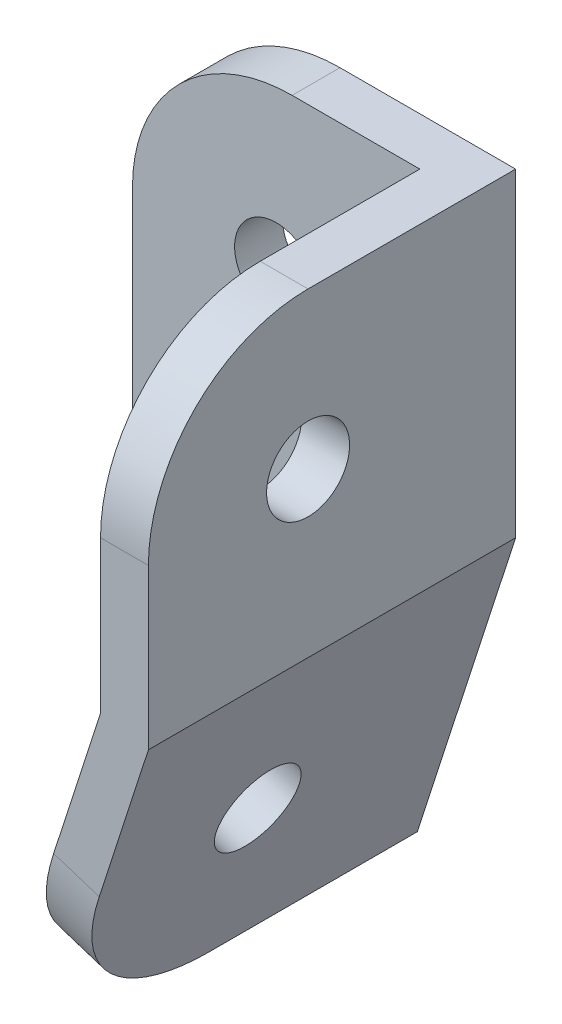
ISO-10303-21;
HEADER;
FILE_DESCRIPTION(('STEP AP214'),'2;1');
FILE_NAME('part.step','',(''),(''),'','','');
FILE_SCHEMA(('AUTOMOTIVE_DESIGN { 1 0 10303 214 1 1 1 1 }'));
ENDSEC;
DATA;
#1=APPLICATION_CONTEXT('core data for automotive mechanical design processes');
#2=APPLICATION_PROTOCOL_DEFINITION('international standard','automotive_design',2000,#1);
#3=PRODUCT_CONTEXT('',#1,'mechanical');
#4=PRODUCT('Part','Part','',(#3));
#5=PRODUCT_RELATED_PRODUCT_CATEGORY('part','',(#4));
#6=PRODUCT_DEFINITION_FORMATION('','',#4);
#7=PRODUCT_DEFINITION_CONTEXT('part definition',#1,'design');
#8=PRODUCT_DEFINITION('design','',#6,#7);
#9=PRODUCT_DEFINITION_SHAPE('','',#8);
#10=(LENGTH_UNIT() NAMED_UNIT(*) SI_UNIT(.MILLI.,.METRE.));
#11=(NAMED_UNIT(*) PLANE_ANGLE_UNIT() SI_UNIT($,.RADIAN.));
#12=(NAMED_UNIT(*) SI_UNIT($,.STERADIAN.) SOLID_ANGLE_UNIT());
#13=UNCERTAINTY_MEASURE_WITH_UNIT(LENGTH_MEASURE(1.E-05),#10,'distance_accuracy_value','');
#14=(GEOMETRIC_REPRESENTATION_CONTEXT(3) GLOBAL_UNCERTAINTY_ASSIGNED_CONTEXT((#13)) GLOBAL_UNIT_ASSIGNED_CONTEXT((#10,
#11,#12)) REPRESENTATION_CONTEXT('',''));
#15=CARTESIAN_POINT('',(0.,0.,0.));
#16=DIRECTION('',(0.,0.,1.));
#17=DIRECTION('',(1.,0.,0.));
#18=AXIS2_PLACEMENT_3D('',#15,#16,#17);
#19=CARTESIAN_POINT('',(97.,112.65,23.));
#20=DIRECTION('',(1.,0.,0.));
#21=DIRECTION('',(0.,0.,-1.));
#22=AXIS2_PLACEMENT_3D('',#19,#20,#21);
#23=PLANE('',#22);
#24=CARTESIAN_POINT('',(97.,102.886797305567,13.));
#25=DIRECTION('',(-1.,0.,0.));
#26=DIRECTION('',(0.,0.,1.));
#27=AXIS2_PLACEMENT_3D('',#24,#25,#26);
#28=CIRCLE('',#27,2.6);
#29=CARTESIAN_POINT('',(97.,102.886797305567,15.6));
#30=VERTEX_POINT('',#29);
#31=EDGE_CURVE('E305',#30,#30,#28,.T.);
#32=ORIENTED_EDGE('',*,*,#31,.F.);
#33=EDGE_LOOP('',(#32));
#34=FACE_BOUND('',#33,.T.);
#35=DIRECTION('',(0.,-1.,0.));
#36=VECTOR('',#35,1.);
#37=CARTESIAN_POINT('',(97.,112.65,23.));
#38=LINE('',#37,#36);
#39=CARTESIAN_POINT('',(97.,102.65,23.));
#40=VERTEX_POINT('',#39);
#41=CARTESIAN_POINT('',(97.,93.1235946111336,23.));
#42=VERTEX_POINT('',#41);
#43=EDGE_CURVE('E154',#40,#42,#38,.T.);
#44=ORIENTED_EDGE('',*,*,#43,.F.);
#45=CARTESIAN_POINT('',(97.,102.65,13.));
#46=DIRECTION('',(1.,0.,0.));
#47=DIRECTION('',(0.,0.,-1.));
#48=AXIS2_PLACEMENT_3D('',#45,#46,#47);
#49=CIRCLE('',#48,10.);
#50=CARTESIAN_POINT('',(97.,112.65,13.));
#51=VERTEX_POINT('',#50);
#52=EDGE_CURVE('E65',#40,#51,#49,.F.);
#53=ORIENTED_EDGE('',*,*,#52,.T.);
#54=DIRECTION('',(0.,0.,-1.));
#55=VECTOR('',#54,1.);
#56=CARTESIAN_POINT('',(97.,112.65,23.));
#57=LINE('',#56,#55);
#58=CARTESIAN_POINT('',(97.,112.65,3.));
#59=VERTEX_POINT('',#58);
#60=EDGE_CURVE('E165',#51,#59,#57,.T.);
#61=ORIENTED_EDGE('',*,*,#60,.T.);
#62=DIRECTION('',(0.,1.,0.));
#63=VECTOR('',#62,1.);
#64=CARTESIAN_POINT('',(97.,93.1235946111336,3.));
#65=LINE('',#64,#63);
#66=CARTESIAN_POINT('',(97.,93.1235946111336,3.));
#67=VERTEX_POINT('',#66);
#68=EDGE_CURVE('E258',#67,#59,#65,.T.);
#69=ORIENTED_EDGE('',*,*,#68,.F.);
#70=DIRECTION('',(0.,0.,-1.));
#71=VECTOR('',#70,1.);
#72=CARTESIAN_POINT('',(97.,93.1235946111336,23.));
#73=LINE('',#72,#71);
#74=EDGE_CURVE('E276',#42,#67,#73,.T.);
#75=ORIENTED_EDGE('',*,*,#74,.F.);
#76=EDGE_LOOP('',(#44,#53,#61,#69,#75));
#77=FACE_BOUND('',#76,.T.);
#78=ADVANCED_FACE('F44',(#34,#77),#23,.F.);
#79=CARTESIAN_POINT('',(97.,93.1235946111336,23.));
#80=DIRECTION('',(0.951369306348152,-0.308052662605985,0.));
#81=DIRECTION('',(0.308052662605985,0.951369306348152,0.));
#82=AXIS2_PLACEMENT_3D('',#79,#80,#81);
#83=PLANE('',#82);
#84=CARTESIAN_POINT('',(93.992419414418,83.8351832359943,13.));
#85=DIRECTION('',(-0.951369306348152,0.308052662605985,0.));
#86=DIRECTION('',(-0.308052662605985,-0.951369306348152,0.));
#87=AXIS2_PLACEMENT_3D('',#84,#85,#86);
#88=CIRCLE('',#87,2.6);
#89=CARTESIAN_POINT('',(93.1914824916424,81.3616230394891,13.));
#90=VERTEX_POINT('',#89);
#91=EDGE_CURVE('E311',#90,#90,#88,.T.);
#92=ORIENTED_EDGE('',*,*,#91,.F.);
#93=EDGE_LOOP('',(#92));
#94=FACE_BOUND('',#93,.T.);
#95=DIRECTION('',(0.,0.,-1.));
#96=VECTOR('',#95,1.);
#97=CARTESIAN_POINT('',(90.9848388288358,74.5467718608549,23.));
#98=LINE('',#97,#96);
#99=CARTESIAN_POINT('',(90.9848388288358,74.5467718608549,13.));
#100=VERTEX_POINT('',#99);
#101=CARTESIAN_POINT('',(90.9848388288358,74.5467718608549,3.));
#102=VERTEX_POINT('',#101);
#103=EDGE_CURVE('E200',#100,#102,#98,.T.);
#104=ORIENTED_EDGE('',*,*,#103,.F.);
#105=CARTESIAN_POINT('',(94.0653654548957,84.0604649243365,13.));
#106=DIRECTION('',(0.951369306348152,-0.308052662605985,0.));
#107=DIRECTION('',(0.308052662605985,0.951369306348152,0.));
#108=AXIS2_PLACEMENT_3D('',#105,#106,#107);
#109=CIRCLE('',#108,10.);
#110=CARTESIAN_POINT('',(94.0653654548957,84.0604649243364,23.));
#111=VERTEX_POINT('',#110);
#112=EDGE_CURVE('E13',#100,#111,#109,.F.);
#113=ORIENTED_EDGE('',*,*,#112,.T.);
#114=DIRECTION('',(-0.308052662605985,-0.951369306348152,0.));
#115=VECTOR('',#114,1.);
#116=CARTESIAN_POINT('',(97.,93.1235946111336,23.));
#117=LINE('',#116,#115);
#118=EDGE_CURVE('E201',#42,#111,#117,.T.);
#119=ORIENTED_EDGE('',*,*,#118,.F.);
#120=ORIENTED_EDGE('',*,*,#74,.T.);
#121=DIRECTION('',(0.308052662605985,0.951369306348152,0.));
#122=VECTOR('',#121,1.);
#123=CARTESIAN_POINT('',(90.9848388288358,74.5467718608549,3.));
#124=LINE('',#123,#122);
#125=EDGE_CURVE('E254',#102,#67,#124,.T.);
#126=ORIENTED_EDGE('',*,*,#125,.F.);
#127=EDGE_LOOP('',(#104,#113,#119,#120,#126));
#128=FACE_BOUND('',#127,.T.);
#129=ADVANCED_FACE('F210',(#94,#128),#83,.F.);
#130=CARTESIAN_POINT('',(93.8389467478803,73.622613873037,23.));
#131=DIRECTION('',(-0.951369306348152,0.308052662605985,0.));
#132=DIRECTION('',(-0.308052662605985,-0.951369306348152,0.));
#133=AXIS2_PLACEMENT_3D('',#130,#131,#132);
#134=PLANE('',#133);
#135=CARTESIAN_POINT('',(96.8465273334624,82.9110252481763,13.));
#136=DIRECTION('',(-0.951369306348152,0.308052662605985,0.));
#137=DIRECTION('',(-0.308052662605985,-0.951369306348152,0.));
#138=AXIS2_PLACEMENT_3D('',#135,#136,#137);
#139=CIRCLE('',#138,2.6);
#140=CARTESIAN_POINT('',(96.0455904106868,80.4374650516711,13.));
#141=VERTEX_POINT('',#140);
#142=EDGE_CURVE('E308',#141,#141,#139,.T.);
#143=ORIENTED_EDGE('',*,*,#142,.T.);
#144=EDGE_LOOP('',(#143));
#145=FACE_BOUND('',#144,.T.);
#146=DIRECTION('',(0.308052662605985,0.951369306348152,0.));
#147=VECTOR('',#146,1.);
#148=CARTESIAN_POINT('',(93.8389467478803,73.622613873037,23.));
#149=LINE('',#148,#147);
#150=CARTESIAN_POINT('',(96.9194733739402,83.1363069365185,23.));
#151=VERTEX_POINT('',#150);
#152=CARTESIAN_POINT('',(100.,92.65,23.));
#153=VERTEX_POINT('',#152);
#154=EDGE_CURVE('E135',#151,#153,#149,.T.);
#155=ORIENTED_EDGE('',*,*,#154,.F.);
#156=CARTESIAN_POINT('',(96.9194733739402,83.1363069365185,13.));
#157=DIRECTION('',(-0.951369306348152,0.308052662605985,0.));
#158=DIRECTION('',(-0.308052662605985,-0.951369306348152,0.));
#159=AXIS2_PLACEMENT_3D('',#156,#157,#158);
#160=CIRCLE('',#159,10.);
#161=CARTESIAN_POINT('',(93.8389467478803,73.622613873037,13.));
#162=VERTEX_POINT('',#161);
#163=EDGE_CURVE('E52',#151,#162,#160,.F.);
#164=ORIENTED_EDGE('',*,*,#163,.T.);
#165=DIRECTION('',(0.,0.,-1.));
#166=VECTOR('',#165,1.);
#167=CARTESIAN_POINT('',(93.8389467478803,73.622613873037,23.));
#168=LINE('',#167,#166);
#169=CARTESIAN_POINT('',(93.8389467478803,73.622613873037,0.));
#170=VERTEX_POINT('',#169);
#171=EDGE_CURVE('E192',#162,#170,#168,.T.);
#172=ORIENTED_EDGE('',*,*,#171,.T.);
#173=DIRECTION('',(0.308052662605985,0.951369306348152,0.));
#174=VECTOR('',#173,1.);
#175=CARTESIAN_POINT('',(93.8389467478803,73.622613873037,0.));
#176=LINE('',#175,#174);
#177=CARTESIAN_POINT('',(100.,92.65,0.));
#178=VERTEX_POINT('',#177);
#179=EDGE_CURVE('E158',#170,#178,#176,.T.);
#180=ORIENTED_EDGE('',*,*,#179,.T.);
#181=DIRECTION('',(0.,0.,-1.));
#182=VECTOR('',#181,1.);
#183=CARTESIAN_POINT('',(100.,92.65,23.));
#184=LINE('',#183,#182);
#185=EDGE_CURVE('E150',#153,#178,#184,.T.);
#186=ORIENTED_EDGE('',*,*,#185,.F.);
#187=EDGE_LOOP('',(#155,#164,#172,#180,#186));
#188=FACE_BOUND('',#187,.T.);
#189=ADVANCED_FACE('F156',(#145,#188),#134,.F.);
#190=CARTESIAN_POINT('',(100.,92.65,23.));
#191=DIRECTION('',(-1.,0.,0.));
#192=DIRECTION('',(0.,0.,1.));
#193=AXIS2_PLACEMENT_3D('',#190,#191,#192);
#194=PLANE('',#193);
#195=CARTESIAN_POINT('',(100.,102.886797305567,13.));
#196=DIRECTION('',(-1.,0.,0.));
#197=DIRECTION('',(0.,0.,1.));
#198=AXIS2_PLACEMENT_3D('',#195,#196,#197);
#199=CIRCLE('',#198,2.6);
#200=CARTESIAN_POINT('',(100.,102.886797305567,15.6));
#201=VERTEX_POINT('',#200);
#202=EDGE_CURVE('E297',#201,#201,#199,.T.);
#203=ORIENTED_EDGE('',*,*,#202,.T.);
#204=EDGE_LOOP('',(#203));
#205=FACE_BOUND('',#204,.T.);
#206=DIRECTION('',(0.,0.,-1.));
#207=VECTOR('',#206,1.);
#208=CARTESIAN_POINT('',(100.,112.65,23.));
#209=LINE('',#208,#207);
#210=CARTESIAN_POINT('',(100.,112.65,13.));
#211=VERTEX_POINT('',#210);
#212=CARTESIAN_POINT('',(100.,112.65,0.));
#213=VERTEX_POINT('',#212);
#214=EDGE_CURVE('E160',#211,#213,#209,.T.);
#215=ORIENTED_EDGE('',*,*,#214,.F.);
#216=CARTESIAN_POINT('',(100.,102.65,13.));
#217=DIRECTION('',(-1.,0.,0.));
#218=DIRECTION('',(0.,0.,1.));
#219=AXIS2_PLACEMENT_3D('',#216,#217,#218);
#220=CIRCLE('',#219,10.);
#221=CARTESIAN_POINT('',(100.,102.65,23.));
#222=VERTEX_POINT('',#221);
#223=EDGE_CURVE('E153',#211,#222,#220,.F.);
#224=ORIENTED_EDGE('',*,*,#223,.T.);
#225=DIRECTION('',(0.,1.,0.));
#226=VECTOR('',#225,1.);
#227=CARTESIAN_POINT('',(100.,92.65,23.));
#228=LINE('',#227,#226);
#229=EDGE_CURVE('E138',#153,#222,#228,.T.);
#230=ORIENTED_EDGE('',*,*,#229,.F.);
#231=ORIENTED_EDGE('',*,*,#185,.T.);
#232=DIRECTION('',(0.,1.,0.));
#233=VECTOR('',#232,1.);
#234=CARTESIAN_POINT('',(100.,92.65,0.));
#235=LINE('',#234,#233);
#236=EDGE_CURVE('E269',#178,#213,#235,.T.);
#237=ORIENTED_EDGE('',*,*,#236,.T.);
#238=EDGE_LOOP('',(#215,#224,#230,#231,#237));
#239=FACE_BOUND('',#238,.T.);
#240=ADVANCED_FACE('F148',(#205,#239),#194,.F.);
#241=CARTESIAN_POINT('',(100.,112.65,23.));
#242=DIRECTION('',(0.,-1.,0.));
#243=DIRECTION('',(0.,0.,-1.));
#244=AXIS2_PLACEMENT_3D('',#241,#242,#243);
#245=PLANE('',#244);
#246=DIRECTION('',(-1.,0.,0.));
#247=VECTOR('',#246,1.);
#248=CARTESIAN_POINT('',(100.,112.65,0.));
#249=LINE('',#248,#247);
#250=CARTESIAN_POINT('',(89.,112.65,0.));
#251=VERTEX_POINT('',#250);
#252=EDGE_CURVE('E271',#213,#251,#249,.T.);
#253=ORIENTED_EDGE('',*,*,#252,.T.);
#254=DIRECTION('',(0.,0.,-1.));
#255=VECTOR('',#254,1.);
#256=CARTESIAN_POINT('',(89.,112.65,23.));
#257=LINE('',#256,#255);
#258=CARTESIAN_POINT('',(89.,112.65,3.));
#259=VERTEX_POINT('',#258);
#260=EDGE_CURVE('E177',#251,#259,#257,.F.);
#261=ORIENTED_EDGE('',*,*,#260,.T.);
#262=DIRECTION('',(-1.,0.,0.));
#263=VECTOR('',#262,1.);
#264=CARTESIAN_POINT('',(79.,112.65,3.));
#265=LINE('',#264,#263);
#266=EDGE_CURVE('E286',#59,#259,#265,.T.);
#267=ORIENTED_EDGE('',*,*,#266,.F.);
#268=ORIENTED_EDGE('',*,*,#60,.F.);
#269=DIRECTION('',(-1.,0.,0.));
#270=VECTOR('',#269,1.);
#271=CARTESIAN_POINT('',(100.,112.65,13.));
#272=LINE('',#271,#270);
#273=EDGE_CURVE('E175',#51,#211,#272,.F.);
#274=ORIENTED_EDGE('',*,*,#273,.T.);
#275=ORIENTED_EDGE('',*,*,#214,.T.);
#276=EDGE_LOOP('',(#253,#261,#267,#268,#274,#275));
#277=FACE_BOUND('',#276,.T.);
#278=ADVANCED_FACE('F222',(#277),#245,.F.);
#279=CARTESIAN_POINT('',(90.9848388288358,74.5467718608549,23.));
#280=DIRECTION('',(0.308052662605986,0.951369306348151,0.));
#281=DIRECTION('',(-0.951369306348151,0.308052662605986,0.));
#282=AXIS2_PLACEMENT_3D('',#279,#280,#281);
#283=PLANE('',#282);
#284=DIRECTION('',(-0.951369306348151,0.308052662605986,0.));
#285=VECTOR('',#284,1.);
#286=CARTESIAN_POINT('',(90.9848388288358,74.5467718608549,3.));
#287=LINE('',#286,#285);
#288=CARTESIAN_POINT('',(85.9194733739401,76.1869333681066,3.));
#289=VERTEX_POINT('',#288);
#290=EDGE_CURVE('E255',#102,#289,#287,.T.);
#291=ORIENTED_EDGE('',*,*,#290,.T.);
#292=DIRECTION('',(0.,0.,1.));
#293=VECTOR('',#292,1.);
#294=CARTESIAN_POINT('',(85.9194733739401,76.1869333681066,23.));
#295=LINE('',#294,#293);
#296=CARTESIAN_POINT('',(85.9194733739401,76.1869333681066,0.));
#297=VERTEX_POINT('',#296);
#298=EDGE_CURVE('E185',#289,#297,#295,.F.);
#299=ORIENTED_EDGE('',*,*,#298,.T.);
#300=DIRECTION('',(0.951369306348151,-0.308052662605986,0.));
#301=VECTOR('',#300,1.);
#302=CARTESIAN_POINT('',(90.9848388288358,74.5467718608549,0.));
#303=LINE('',#302,#301);
#304=EDGE_CURVE('E143',#297,#170,#303,.T.);
#305=ORIENTED_EDGE('',*,*,#304,.T.);
#306=ORIENTED_EDGE('',*,*,#171,.F.);
#307=DIRECTION('',(0.951369306348151,-0.308052662605986,0.));
#308=VECTOR('',#307,1.);
#309=CARTESIAN_POINT('',(90.9848388288358,74.5467718608549,13.));
#310=LINE('',#309,#308);
#311=EDGE_CURVE('E183',#162,#100,#310,.F.);
#312=ORIENTED_EDGE('',*,*,#311,.T.);
#313=ORIENTED_EDGE('',*,*,#103,.T.);
#314=EDGE_LOOP('',(#291,#299,#305,#306,#312,#313));
#315=FACE_BOUND('',#314,.T.);
#316=ADVANCED_FACE('F198',(#315),#283,.F.);
#317=CARTESIAN_POINT('',(0.,0.,23.));
#318=DIRECTION('',(0.,0.,-1.));
#319=DIRECTION('',(-1.,0.,0.));
#320=AXIS2_PLACEMENT_3D('',#317,#318,#319);
#321=PLANE('',#320);
#322=ORIENTED_EDGE('',*,*,#229,.T.);
#323=DIRECTION('',(-1.,0.,0.));
#324=VECTOR('',#323,1.);
#325=CARTESIAN_POINT('',(0.,102.65,23.));
#326=LINE('',#325,#324);
#327=EDGE_CURVE('E188',#222,#40,#326,.T.);
#328=ORIENTED_EDGE('',*,*,#327,.T.);
#329=ORIENTED_EDGE('',*,*,#43,.T.);
#330=ORIENTED_EDGE('',*,*,#118,.T.);
#331=DIRECTION('',(0.951369306348151,-0.308052662605986,0.));
#332=VECTOR('',#331,1.);
#333=CARTESIAN_POINT('',(33.5622243796449,103.65133629247,23.));
#334=LINE('',#333,#332);
#335=EDGE_CURVE('E140',#111,#151,#334,.T.);
#336=ORIENTED_EDGE('',*,*,#335,.T.);
#337=ORIENTED_EDGE('',*,*,#154,.T.);
#338=EDGE_LOOP('',(#322,#328,#329,#330,#336,#337));
#339=FACE_BOUND('',#338,.T.);
#340=ADVANCED_FACE('F137',(#339),#321,.F.);
#341=CARTESIAN_POINT('',(0.,0.,0.));
#342=DIRECTION('',(0.,0.,-1.));
#343=DIRECTION('',(-1.,0.,0.));
#344=AXIS2_PLACEMENT_3D('',#341,#342,#343);
#345=PLANE('',#344);
#346=CARTESIAN_POINT('',(88.,102.65,0.));
#347=DIRECTION('',(0.,0.,1.));
#348=DIRECTION('',(1.,0.,0.));
#349=AXIS2_PLACEMENT_3D('',#346,#347,#348);
#350=CIRCLE('',#349,2.6);
#351=CARTESIAN_POINT('',(90.6,102.65,0.));
#352=VERTEX_POINT('',#351);
#353=EDGE_CURVE('E260',#352,#352,#350,.T.);
#354=ORIENTED_EDGE('',*,*,#353,.T.);
#355=EDGE_LOOP('',(#354));
#356=FACE_BOUND('',#355,.T.);
#357=CARTESIAN_POINT('',(88.,82.65,0.));
#358=DIRECTION('',(0.,0.,1.));
#359=DIRECTION('',(1.,0.,0.));
#360=AXIS2_PLACEMENT_3D('',#357,#358,#359);
#361=CIRCLE('',#360,2.6);
#362=CARTESIAN_POINT('',(90.6,82.65,0.));
#363=VERTEX_POINT('',#362);
#364=EDGE_CURVE('E296',#363,#363,#361,.T.);
#365=ORIENTED_EDGE('',*,*,#364,.T.);
#366=EDGE_LOOP('',(#365));
#367=FACE_BOUND('',#366,.T.);
#368=DIRECTION('',(0.,-1.,0.));
#369=VECTOR('',#368,1.);
#370=CARTESIAN_POINT('',(79.,112.65,0.));
#371=LINE('',#370,#369);
#372=CARTESIAN_POINT('',(79.,102.65,0.));
#373=VERTEX_POINT('',#372);
#374=CARTESIAN_POINT('',(79.,85.7006264315882,0.));
#375=VERTEX_POINT('',#374);
#376=EDGE_CURVE('E248',#373,#375,#371,.T.);
#377=ORIENTED_EDGE('',*,*,#376,.F.);
#378=CARTESIAN_POINT('',(89.,102.65,0.));
#379=DIRECTION('',(0.,0.,-1.));
#380=DIRECTION('',(-1.,0.,0.));
#381=AXIS2_PLACEMENT_3D('',#378,#379,#380);
#382=CIRCLE('',#381,10.);
#383=EDGE_CURVE('E173',#373,#251,#382,.T.);
#384=ORIENTED_EDGE('',*,*,#383,.T.);
#385=ORIENTED_EDGE('',*,*,#252,.F.);
#386=ORIENTED_EDGE('',*,*,#236,.F.);
#387=ORIENTED_EDGE('',*,*,#179,.F.);
#388=ORIENTED_EDGE('',*,*,#304,.F.);
#389=CARTESIAN_POINT('',(89.,85.7006264315882,0.));
#390=DIRECTION('',(0.,0.,-1.));
#391=DIRECTION('',(-1.,0.,0.));
#392=AXIS2_PLACEMENT_3D('',#389,#390,#391);
#393=CIRCLE('',#392,10.);
#394=EDGE_CURVE('E171',#297,#375,#393,.T.);
#395=ORIENTED_EDGE('',*,*,#394,.T.);
#396=EDGE_LOOP('',(#377,#384,#385,#386,#387,#388,#395));
#397=FACE_BOUND('',#396,.T.);
#398=ADVANCED_FACE('F247',(#356,#367,#397),#345,.T.);
#399=CARTESIAN_POINT('',(79.,112.65,3.));
#400=DIRECTION('',(1.,0.,0.));
#401=DIRECTION('',(0.,1.,0.));
#402=AXIS2_PLACEMENT_3D('',#399,#400,#401);
#403=PLANE('',#402);
#404=DIRECTION('',(0.,-1.,0.));
#405=VECTOR('',#404,1.);
#406=CARTESIAN_POINT('',(79.,112.65,3.));
#407=LINE('',#406,#405);
#408=CARTESIAN_POINT('',(79.,102.65,3.));
#409=VERTEX_POINT('',#408);
#410=CARTESIAN_POINT('',(79.,85.7006264315882,3.));
#411=VERTEX_POINT('',#410);
#412=EDGE_CURVE('E263',#409,#411,#407,.T.);
#413=ORIENTED_EDGE('',*,*,#412,.F.);
#414=DIRECTION('',(0.,0.,-1.));
#415=VECTOR('',#414,1.);
#416=CARTESIAN_POINT('',(79.,102.65,3.));
#417=LINE('',#416,#415);
#418=EDGE_CURVE('E163',#409,#373,#417,.T.);
#419=ORIENTED_EDGE('',*,*,#418,.T.);
#420=ORIENTED_EDGE('',*,*,#376,.T.);
#421=DIRECTION('',(0.,0.,1.));
#422=VECTOR('',#421,1.);
#423=CARTESIAN_POINT('',(79.,85.7006264315882,3.));
#424=LINE('',#423,#422);
#425=EDGE_CURVE('E159',#375,#411,#424,.T.);
#426=ORIENTED_EDGE('',*,*,#425,.T.);
#427=EDGE_LOOP('',(#413,#419,#420,#426));
#428=FACE_BOUND('',#427,.T.);
#429=ADVANCED_FACE('F251',(#428),#403,.F.);
#430=CARTESIAN_POINT('',(0.,0.,3.));
#431=DIRECTION('',(0.,0.,-1.));
#432=DIRECTION('',(-1.,0.,0.));
#433=AXIS2_PLACEMENT_3D('',#430,#431,#432);
#434=PLANE('',#433);
#435=CARTESIAN_POINT('',(88.,102.65,3.));
#436=DIRECTION('',(0.,0.,1.));
#437=DIRECTION('',(1.,0.,0.));
#438=AXIS2_PLACEMENT_3D('',#435,#436,#437);
#439=CIRCLE('',#438,2.6);
#440=CARTESIAN_POINT('',(90.6,102.65,3.));
#441=VERTEX_POINT('',#440);
#442=EDGE_CURVE('E300',#441,#441,#439,.T.);
#443=ORIENTED_EDGE('',*,*,#442,.F.);
#444=EDGE_LOOP('',(#443));
#445=FACE_BOUND('',#444,.T.);
#446=CARTESIAN_POINT('',(88.,82.65,3.));
#447=DIRECTION('',(0.,0.,1.));
#448=DIRECTION('',(1.,0.,0.));
#449=AXIS2_PLACEMENT_3D('',#446,#447,#448);
#450=CIRCLE('',#449,2.6);
#451=CARTESIAN_POINT('',(90.6,82.65,3.));
#452=VERTEX_POINT('',#451);
#453=EDGE_CURVE('E293',#452,#452,#450,.T.);
#454=ORIENTED_EDGE('',*,*,#453,.F.);
#455=EDGE_LOOP('',(#454));
#456=FACE_BOUND('',#455,.T.);
#457=ORIENTED_EDGE('',*,*,#266,.T.);
#458=CARTESIAN_POINT('',(89.,102.65,3.));
#459=DIRECTION('',(0.,0.,-1.));
#460=DIRECTION('',(-1.,0.,0.));
#461=AXIS2_PLACEMENT_3D('',#458,#459,#460);
#462=CIRCLE('',#461,10.);
#463=EDGE_CURVE('E181',#259,#409,#462,.F.);
#464=ORIENTED_EDGE('',*,*,#463,.T.);
#465=ORIENTED_EDGE('',*,*,#412,.T.);
#466=CARTESIAN_POINT('',(89.,85.7006264315882,3.));
#467=DIRECTION('',(0.,0.,-1.));
#468=DIRECTION('',(-1.,0.,0.));
#469=AXIS2_PLACEMENT_3D('',#466,#467,#468);
#470=CIRCLE('',#469,10.);
#471=EDGE_CURVE('E179',#411,#289,#470,.F.);
#472=ORIENTED_EDGE('',*,*,#471,.T.);
#473=ORIENTED_EDGE('',*,*,#290,.F.);
#474=ORIENTED_EDGE('',*,*,#125,.T.);
#475=ORIENTED_EDGE('',*,*,#68,.T.);
#476=EDGE_LOOP('',(#457,#464,#465,#472,#473,#474,#475));
#477=FACE_BOUND('',#476,.T.);
#478=ADVANCED_FACE('F285',(#445,#456,#477),#434,.F.);
#479=CARTESIAN_POINT('',(88.,82.65,0.));
#480=DIRECTION('',(0.,0.,1.));
#481=DIRECTION('',(1.,0.,0.));
#482=AXIS2_PLACEMENT_3D('',#479,#480,#481);
#483=CYLINDRICAL_SURFACE('',#482,2.6);
#484=ORIENTED_EDGE('',*,*,#364,.F.);
#485=EDGE_LOOP('',(#484));
#486=FACE_BOUND('',#485,.T.);
#487=ORIENTED_EDGE('',*,*,#453,.T.);
#488=EDGE_LOOP('',(#487));
#489=FACE_BOUND('',#488,.T.);
#490=ADVANCED_FACE('F332',(#486,#489),#483,.F.);
#491=CARTESIAN_POINT('',(88.,102.65,0.));
#492=DIRECTION('',(0.,0.,1.));
#493=DIRECTION('',(1.,0.,0.));
#494=AXIS2_PLACEMENT_3D('',#491,#492,#493);
#495=CYLINDRICAL_SURFACE('',#494,2.6);
#496=ORIENTED_EDGE('',*,*,#353,.F.);
#497=EDGE_LOOP('',(#496));
#498=FACE_BOUND('',#497,.T.);
#499=ORIENTED_EDGE('',*,*,#442,.T.);
#500=EDGE_LOOP('',(#499));
#501=FACE_BOUND('',#500,.T.);
#502=ADVANCED_FACE('F326',(#498,#501),#495,.F.);
#503=CARTESIAN_POINT('',(100.,102.886797305567,13.));
#504=DIRECTION('',(-1.,0.,0.));
#505=DIRECTION('',(0.,0.,1.));
#506=AXIS2_PLACEMENT_3D('',#503,#504,#505);
#507=CYLINDRICAL_SURFACE('',#506,2.6);
#508=ORIENTED_EDGE('',*,*,#202,.F.);
#509=EDGE_LOOP('',(#508));
#510=FACE_BOUND('',#509,.T.);
#511=ORIENTED_EDGE('',*,*,#31,.T.);
#512=EDGE_LOOP('',(#511));
#513=FACE_BOUND('',#512,.T.);
#514=ADVANCED_FACE('F319',(#510,#513),#507,.F.);
#515=CARTESIAN_POINT('',(96.8465273334624,82.9110252481763,13.));
#516=DIRECTION('',(-0.951369306348152,0.308052662605985,0.));
#517=DIRECTION('',(-0.308052662605985,-0.951369306348152,0.));
#518=AXIS2_PLACEMENT_3D('',#515,#516,#517);
#519=CYLINDRICAL_SURFACE('',#518,2.6);
#520=ORIENTED_EDGE('',*,*,#142,.F.);
#521=EDGE_LOOP('',(#520));
#522=FACE_BOUND('',#521,.T.);
#523=ORIENTED_EDGE('',*,*,#91,.T.);
#524=EDGE_LOOP('',(#523));
#525=FACE_BOUND('',#524,.T.);
#526=ADVANCED_FACE('F235',(#522,#525),#519,.F.);
#527=CARTESIAN_POINT('',(89.,102.65,3.));
#528=DIRECTION('',(0.,0.,-1.));
#529=DIRECTION('',(-1.,0.,0.));
#530=AXIS2_PLACEMENT_3D('',#527,#528,#529);
#531=CYLINDRICAL_SURFACE('',#530,10.);
#532=ORIENTED_EDGE('',*,*,#463,.F.);
#533=ORIENTED_EDGE('',*,*,#260,.F.);
#534=ORIENTED_EDGE('',*,*,#383,.F.);
#535=ORIENTED_EDGE('',*,*,#418,.F.);
#536=EDGE_LOOP('',(#532,#533,#534,#535));
#537=FACE_BOUND('',#536,.T.);
#538=ADVANCED_FACE('F232',(#537),#531,.T.);
#539=CARTESIAN_POINT('',(89.,85.7006264315882,3.));
#540=DIRECTION('',(0.,0.,1.));
#541=DIRECTION('',(1.,0.,0.));
#542=AXIS2_PLACEMENT_3D('',#539,#540,#541);
#543=CYLINDRICAL_SURFACE('',#542,10.);
#544=ORIENTED_EDGE('',*,*,#394,.F.);
#545=ORIENTED_EDGE('',*,*,#298,.F.);
#546=ORIENTED_EDGE('',*,*,#471,.F.);
#547=ORIENTED_EDGE('',*,*,#425,.F.);
#548=EDGE_LOOP('',(#544,#545,#546,#547));
#549=FACE_BOUND('',#548,.T.);
#550=ADVANCED_FACE('F208',(#549),#543,.T.);
#551=CARTESIAN_POINT('',(0.,102.65,13.));
#552=DIRECTION('',(-1.,0.,0.));
#553=DIRECTION('',(0.,0.,1.));
#554=AXIS2_PLACEMENT_3D('',#551,#552,#553);
#555=CYLINDRICAL_SURFACE('',#554,10.);
#556=ORIENTED_EDGE('',*,*,#223,.F.);
#557=ORIENTED_EDGE('',*,*,#273,.F.);
#558=ORIENTED_EDGE('',*,*,#52,.F.);
#559=ORIENTED_EDGE('',*,*,#327,.F.);
#560=EDGE_LOOP('',(#556,#557,#558,#559));
#561=FACE_BOUND('',#560,.T.);
#562=ADVANCED_FACE('F204',(#561),#555,.T.);
#563=CARTESIAN_POINT('',(33.5622243796449,103.65133629247,13.));
#564=DIRECTION('',(0.951369306348151,-0.308052662605986,0.));
#565=DIRECTION('',(0.308052662605986,0.951369306348151,0.));
#566=AXIS2_PLACEMENT_3D('',#563,#564,#565);
#567=CYLINDRICAL_SURFACE('',#566,10.);
#568=ORIENTED_EDGE('',*,*,#112,.F.);
#569=ORIENTED_EDGE('',*,*,#311,.F.);
#570=ORIENTED_EDGE('',*,*,#163,.F.);
#571=ORIENTED_EDGE('',*,*,#335,.F.);
#572=EDGE_LOOP('',(#568,#569,#570,#571));
#573=FACE_BOUND('',#572,.T.);
#574=ADVANCED_FACE('F46',(#573),#567,.T.);
#575=CLOSED_SHELL('',(#78,#129,#189,#240,#278,#316,#340,#398,#429,#478,#490,#502,#514,#526,#538,
#550,#562,#574));
#576=MANIFOLD_SOLID_BREP('B2',#575);
#577=ADVANCED_BREP_SHAPE_REPRESENTATION('',(#18,#576),#14);
#578=SHAPE_DEFINITION_REPRESENTATION(#9,#577);
ENDSEC;
END-ISO-10303-21;
